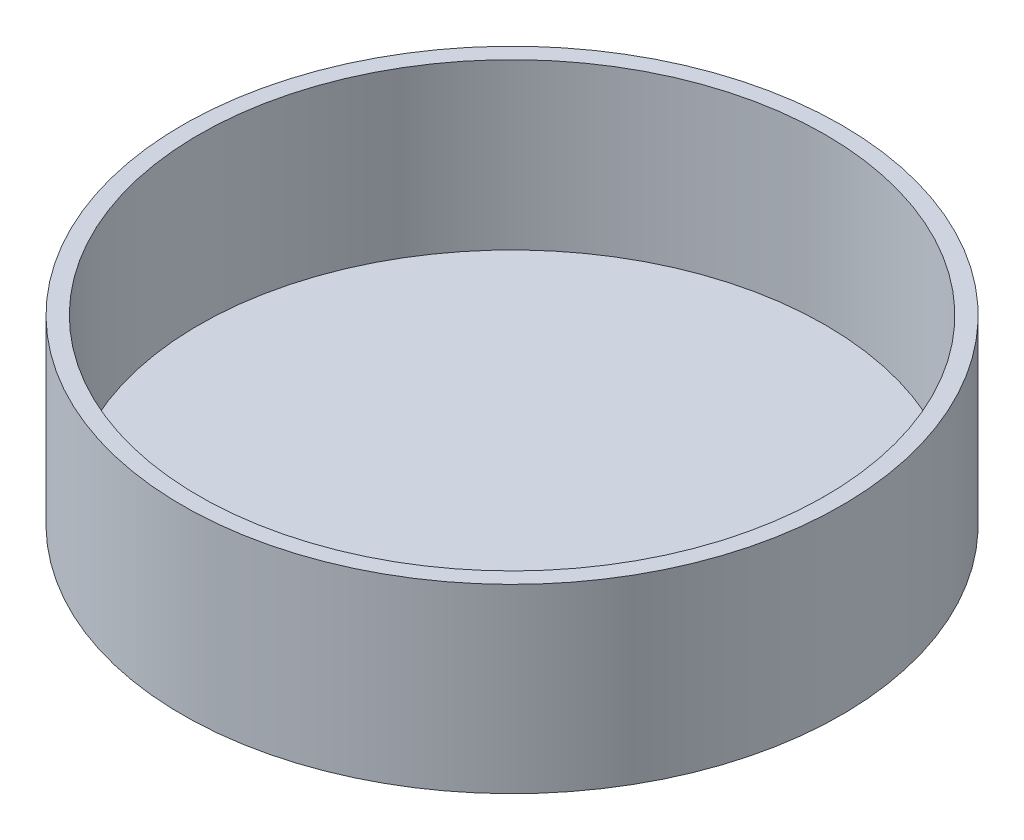
ISO-10303-21;
HEADER;
FILE_DESCRIPTION(('STEP AP214'),'2;1');
FILE_NAME('part.step','',(''),(''),'','','');
FILE_SCHEMA(('AUTOMOTIVE_DESIGN { 1 0 10303 214 1 1 1 1 }'));
ENDSEC;
DATA;
#1=APPLICATION_CONTEXT('core data for automotive mechanical design processes');
#2=APPLICATION_PROTOCOL_DEFINITION('international standard','automotive_design',2000,#1);
#3=PRODUCT_CONTEXT('',#1,'mechanical');
#4=PRODUCT('Part','Part','',(#3));
#5=PRODUCT_RELATED_PRODUCT_CATEGORY('part','',(#4));
#6=PRODUCT_DEFINITION_FORMATION('','',#4);
#7=PRODUCT_DEFINITION_CONTEXT('part definition',#1,'design');
#8=PRODUCT_DEFINITION('design','',#6,#7);
#9=PRODUCT_DEFINITION_SHAPE('','',#8);
#10=(LENGTH_UNIT() NAMED_UNIT(*) SI_UNIT(.MILLI.,.METRE.));
#11=(NAMED_UNIT(*) PLANE_ANGLE_UNIT() SI_UNIT($,.RADIAN.));
#12=(NAMED_UNIT(*) SI_UNIT($,.STERADIAN.) SOLID_ANGLE_UNIT());
#13=UNCERTAINTY_MEASURE_WITH_UNIT(LENGTH_MEASURE(1.E-05),#10,'distance_accuracy_value','');
#14=(GEOMETRIC_REPRESENTATION_CONTEXT(3) GLOBAL_UNCERTAINTY_ASSIGNED_CONTEXT((#13)) GLOBAL_UNIT_ASSIGNED_CONTEXT((#10,
#11,#12)) REPRESENTATION_CONTEXT('',''));
#15=CARTESIAN_POINT('',(0.,0.,0.));
#16=DIRECTION('',(0.,0.,1.));
#17=DIRECTION('',(1.,0.,0.));
#18=AXIS2_PLACEMENT_3D('',#15,#16,#17);
#19=CARTESIAN_POINT('',(0.,0.,0.));
#20=DIRECTION('',(0.,-1.,0.));
#21=DIRECTION('',(0.,0.,-1.));
#22=AXIS2_PLACEMENT_3D('',#19,#20,#21);
#23=CYLINDRICAL_SURFACE('',#22,100.);
#24=CARTESIAN_POINT('',(0.,50.,0.));
#25=DIRECTION('',(0.,-1.,0.));
#26=DIRECTION('',(0.,0.,-1.));
#27=AXIS2_PLACEMENT_3D('',#24,#25,#26);
#28=CIRCLE('',#27,100.);
#29=CARTESIAN_POINT('',(0.,50.,-100.));
#30=VERTEX_POINT('',#29);
#31=EDGE_CURVE('E60',#30,#30,#28,.T.);
#32=ORIENTED_EDGE('',*,*,#31,.T.);
#33=EDGE_LOOP('',(#32));
#34=FACE_BOUND('',#33,.T.);
#35=CARTESIAN_POINT('',(0.,-5.,0.));
#36=DIRECTION('',(0.,-1.,0.));
#37=DIRECTION('',(0.,0.,-1.));
#38=AXIS2_PLACEMENT_3D('',#35,#36,#37);
#39=CIRCLE('',#38,100.);
#40=CARTESIAN_POINT('',(0.,-5.,-100.));
#41=VERTEX_POINT('',#40);
#42=EDGE_CURVE('E10',#41,#41,#39,.T.);
#43=ORIENTED_EDGE('',*,*,#42,.F.);
#44=EDGE_LOOP('',(#43));
#45=FACE_BOUND('',#44,.T.);
#46=ADVANCED_FACE('F43',(#34,#45),#23,.T.);
#47=CARTESIAN_POINT('',(0.,-5.,0.));
#48=DIRECTION('',(0.,-1.,0.));
#49=DIRECTION('',(0.,0.,-1.));
#50=AXIS2_PLACEMENT_3D('',#47,#48,#49);
#51=PLANE('',#50);
#52=ORIENTED_EDGE('',*,*,#42,.T.);
#53=EDGE_LOOP('',(#52));
#54=FACE_BOUND('',#53,.T.);
#55=ADVANCED_FACE('F82',(#54),#51,.T.);
#56=CARTESIAN_POINT('',(0.,0.,0.));
#57=DIRECTION('',(0.,-1.,0.));
#58=DIRECTION('',(0.,0.,-1.));
#59=AXIS2_PLACEMENT_3D('',#56,#57,#58);
#60=PLANE('',#59);
#61=CARTESIAN_POINT('',(0.,0.,0.));
#62=DIRECTION('',(0.,-1.,0.));
#63=DIRECTION('',(0.,0.,-1.));
#64=AXIS2_PLACEMENT_3D('',#61,#62,#63);
#65=CIRCLE('',#64,95.);
#66=CARTESIAN_POINT('',(0.,0.,-95.));
#67=VERTEX_POINT('',#66);
#68=EDGE_CURVE('E50',#67,#67,#65,.T.);
#69=ORIENTED_EDGE('',*,*,#68,.F.);
#70=EDGE_LOOP('',(#69));
#71=FACE_BOUND('',#70,.T.);
#72=ADVANCED_FACE('F77',(#71),#60,.F.);
#73=CARTESIAN_POINT('',(0.,0.,0.));
#74=DIRECTION('',(0.,-1.,0.));
#75=DIRECTION('',(0.,0.,-1.));
#76=AXIS2_PLACEMENT_3D('',#73,#74,#75);
#77=CYLINDRICAL_SURFACE('',#76,95.);
#78=CARTESIAN_POINT('',(0.,50.,0.));
#79=DIRECTION('',(0.,-1.,0.));
#80=DIRECTION('',(0.,0.,-1.));
#81=AXIS2_PLACEMENT_3D('',#78,#79,#80);
#82=CIRCLE('',#81,95.);
#83=CARTESIAN_POINT('',(0.,50.,-95.));
#84=VERTEX_POINT('',#83);
#85=EDGE_CURVE('E55',#84,#84,#82,.T.);
#86=ORIENTED_EDGE('',*,*,#85,.F.);
#87=EDGE_LOOP('',(#86));
#88=FACE_BOUND('',#87,.T.);
#89=ORIENTED_EDGE('',*,*,#68,.T.);
#90=EDGE_LOOP('',(#89));
#91=FACE_BOUND('',#90,.T.);
#92=ADVANCED_FACE('F72',(#88,#91),#77,.F.);
#93=CARTESIAN_POINT('',(95.,50.,0.));
#94=DIRECTION('',(0.,-1.,0.));
#95=DIRECTION('',(0.,0.,-1.));
#96=AXIS2_PLACEMENT_3D('',#93,#94,#95);
#97=PLANE('',#96);
#98=ORIENTED_EDGE('',*,*,#31,.F.);
#99=EDGE_LOOP('',(#98));
#100=FACE_BOUND('',#99,.T.);
#101=ORIENTED_EDGE('',*,*,#85,.T.);
#102=EDGE_LOOP('',(#101));
#103=FACE_BOUND('',#102,.T.);
#104=ADVANCED_FACE('F69',(#100,#103),#97,.F.);
#105=CLOSED_SHELL('',(#46,#55,#72,#92,#104));
#106=MANIFOLD_SOLID_BREP('B2',#105);
#107=ADVANCED_BREP_SHAPE_REPRESENTATION('',(#18,#106),#14);
#108=SHAPE_DEFINITION_REPRESENTATION(#9,#107);
ENDSEC;
END-ISO-10303-21;
